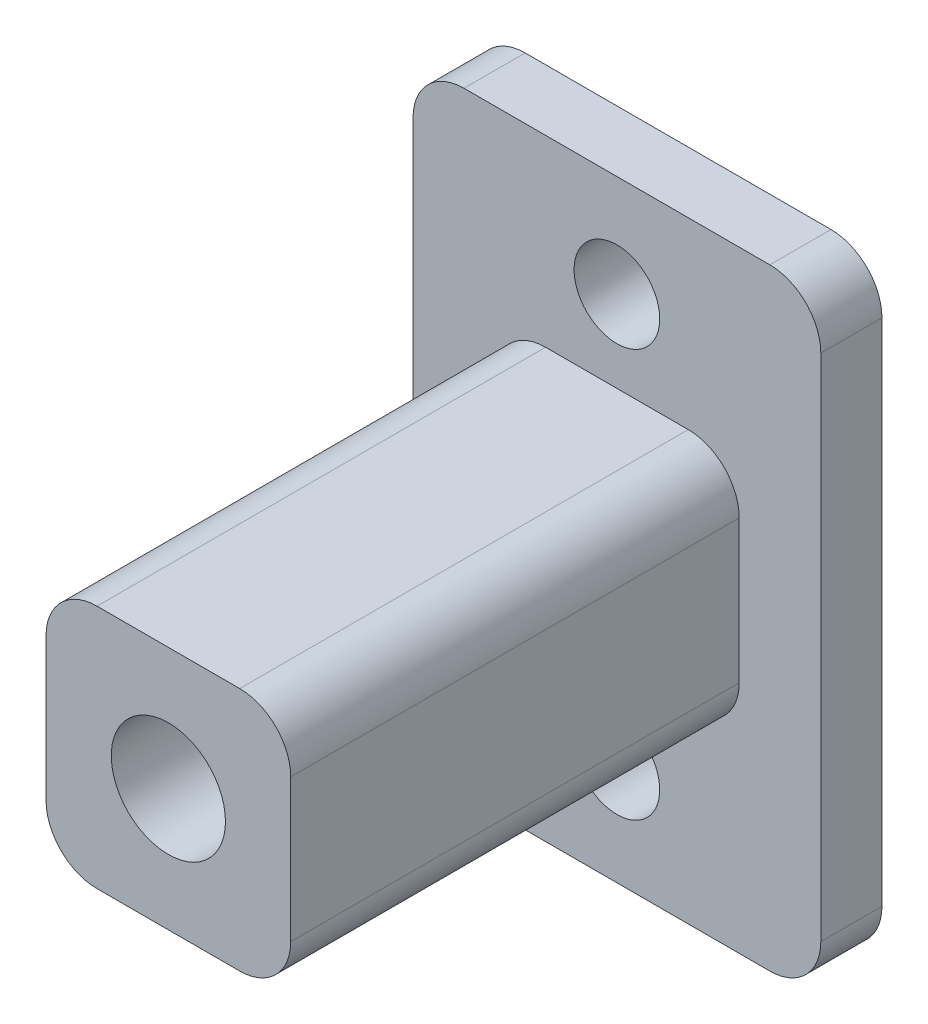
ISO-10303-21;
HEADER;
FILE_DESCRIPTION(('STEP AP214'),'2;1');
FILE_NAME('part.step','',(''),(''),'','','');
FILE_SCHEMA(('AUTOMOTIVE_DESIGN { 1 0 10303 214 1 1 1 1 }'));
ENDSEC;
DATA;
#1=APPLICATION_CONTEXT('core data for automotive mechanical design processes');
#2=APPLICATION_PROTOCOL_DEFINITION('international standard','automotive_design',2000,#1);
#3=PRODUCT_CONTEXT('',#1,'mechanical');
#4=PRODUCT('Part','Part','',(#3));
#5=PRODUCT_RELATED_PRODUCT_CATEGORY('part','',(#4));
#6=PRODUCT_DEFINITION_FORMATION('','',#4);
#7=PRODUCT_DEFINITION_CONTEXT('part definition',#1,'design');
#8=PRODUCT_DEFINITION('design','',#6,#7);
#9=PRODUCT_DEFINITION_SHAPE('','',#8);
#10=(LENGTH_UNIT() NAMED_UNIT(*) SI_UNIT(.MILLI.,.METRE.));
#11=(NAMED_UNIT(*) PLANE_ANGLE_UNIT() SI_UNIT($,.RADIAN.));
#12=(NAMED_UNIT(*) SI_UNIT($,.STERADIAN.) SOLID_ANGLE_UNIT());
#13=UNCERTAINTY_MEASURE_WITH_UNIT(LENGTH_MEASURE(1.E-05),#10,'distance_accuracy_value','');
#14=(GEOMETRIC_REPRESENTATION_CONTEXT(3) GLOBAL_UNCERTAINTY_ASSIGNED_CONTEXT((#13)) GLOBAL_UNIT_ASSIGNED_CONTEXT((#10,
#11,#12)) REPRESENTATION_CONTEXT('',''));
#15=CARTESIAN_POINT('',(0.,0.,0.));
#16=DIRECTION('',(0.,0.,1.));
#17=DIRECTION('',(1.,0.,0.));
#18=AXIS2_PLACEMENT_3D('',#15,#16,#17);
#19=CARTESIAN_POINT('',(0.,0.,3.));
#20=DIRECTION('',(0.,0.,1.));
#21=DIRECTION('',(1.,0.,0.));
#22=AXIS2_PLACEMENT_3D('',#19,#20,#21);
#23=PLANE('',#22);
#24=DIRECTION('',(-1.,0.,0.));
#25=VECTOR('',#24,1.);
#26=CARTESIAN_POINT('',(0.,-6.,3.));
#27=LINE('',#26,#25);
#28=CARTESIAN_POINT('',(3.5,-6.,3.));
#29=VERTEX_POINT('',#28);
#30=CARTESIAN_POINT('',(-3.5,-6.,3.));
#31=VERTEX_POINT('',#30);
#32=EDGE_CURVE('E251',#29,#31,#27,.T.);
#33=ORIENTED_EDGE('',*,*,#32,.T.);
#34=CARTESIAN_POINT('',(-3.5,-3.5,3.));
#35=DIRECTION('',(0.,0.,1.));
#36=DIRECTION('',(1.,0.,0.));
#37=AXIS2_PLACEMENT_3D('',#34,#35,#36);
#38=CIRCLE('',#37,2.5);
#39=CARTESIAN_POINT('',(-6.,-3.5,3.));
#40=VERTEX_POINT('',#39);
#41=EDGE_CURVE('E46',#31,#40,#38,.F.);
#42=ORIENTED_EDGE('',*,*,#41,.T.);
#43=DIRECTION('',(0.,1.,0.));
#44=VECTOR('',#43,1.);
#45=CARTESIAN_POINT('',(-6.,0.,3.));
#46=LINE('',#45,#44);
#47=CARTESIAN_POINT('',(-6.,3.5,3.));
#48=VERTEX_POINT('',#47);
#49=EDGE_CURVE('E250',#40,#48,#46,.T.);
#50=ORIENTED_EDGE('',*,*,#49,.T.);
#51=CARTESIAN_POINT('',(-3.5,3.5,3.));
#52=DIRECTION('',(0.,0.,1.));
#53=DIRECTION('',(1.,0.,0.));
#54=AXIS2_PLACEMENT_3D('',#51,#52,#53);
#55=CIRCLE('',#54,2.5);
#56=CARTESIAN_POINT('',(-3.5,6.,3.));
#57=VERTEX_POINT('',#56);
#58=EDGE_CURVE('E12',#48,#57,#55,.F.);
#59=ORIENTED_EDGE('',*,*,#58,.T.);
#60=DIRECTION('',(-1.,0.,0.));
#61=VECTOR('',#60,1.);
#62=CARTESIAN_POINT('',(0.,6.,3.));
#63=LINE('',#62,#61);
#64=CARTESIAN_POINT('',(3.5,6.,3.));
#65=VERTEX_POINT('',#64);
#66=EDGE_CURVE('E271',#65,#57,#63,.T.);
#67=ORIENTED_EDGE('',*,*,#66,.F.);
#68=CARTESIAN_POINT('',(3.5,3.5,3.));
#69=DIRECTION('',(0.,0.,1.));
#70=DIRECTION('',(1.,0.,0.));
#71=AXIS2_PLACEMENT_3D('',#68,#69,#70);
#72=CIRCLE('',#71,2.5);
#73=CARTESIAN_POINT('',(6.,3.5,3.));
#74=VERTEX_POINT('',#73);
#75=EDGE_CURVE('E242',#65,#74,#72,.F.);
#76=ORIENTED_EDGE('',*,*,#75,.T.);
#77=DIRECTION('',(0.,1.,0.));
#78=VECTOR('',#77,1.);
#79=CARTESIAN_POINT('',(6.,0.,3.));
#80=LINE('',#79,#78);
#81=CARTESIAN_POINT('',(6.,-3.5,3.));
#82=VERTEX_POINT('',#81);
#83=EDGE_CURVE('E279',#82,#74,#80,.T.);
#84=ORIENTED_EDGE('',*,*,#83,.F.);
#85=CARTESIAN_POINT('',(3.5,-3.5,3.));
#86=DIRECTION('',(0.,0.,1.));
#87=DIRECTION('',(1.,0.,0.));
#88=AXIS2_PLACEMENT_3D('',#85,#86,#87);
#89=CIRCLE('',#88,2.5);
#90=EDGE_CURVE('E244',#82,#29,#89,.F.);
#91=ORIENTED_EDGE('',*,*,#90,.T.);
#92=EDGE_LOOP('',(#33,#42,#50,#59,#67,#76,#84,#91));
#93=FACE_BOUND('',#92,.T.);
#94=CARTESIAN_POINT('',(0.,9.99999999999999,3.));
#95=DIRECTION('',(0.,0.,1.));
#96=DIRECTION('',(1.,0.,0.));
#97=AXIS2_PLACEMENT_3D('',#94,#95,#96);
#98=CIRCLE('',#97,2.1);
#99=CARTESIAN_POINT('',(2.1,9.99999999999999,3.));
#100=VERTEX_POINT('',#99);
#101=EDGE_CURVE('E290',#100,#100,#98,.T.);
#102=ORIENTED_EDGE('',*,*,#101,.F.);
#103=EDGE_LOOP('',(#102));
#104=FACE_BOUND('',#103,.T.);
#105=DIRECTION('',(1.,0.,0.));
#106=VECTOR('',#105,1.);
#107=CARTESIAN_POINT('',(10.,-15.,3.));
#108=LINE('',#107,#106);
#109=CARTESIAN_POINT('',(-7.5,-15.,3.));
#110=VERTEX_POINT('',#109);
#111=CARTESIAN_POINT('',(7.5,-15.,3.));
#112=VERTEX_POINT('',#111);
#113=EDGE_CURVE('E297',#110,#112,#108,.T.);
#114=ORIENTED_EDGE('',*,*,#113,.T.);
#115=CARTESIAN_POINT('',(7.5,-12.5,3.));
#116=DIRECTION('',(0.,0.,1.));
#117=DIRECTION('',(1.,0.,0.));
#118=AXIS2_PLACEMENT_3D('',#115,#116,#117);
#119=CIRCLE('',#118,2.5);
#120=CARTESIAN_POINT('',(10.,-12.5,3.));
#121=VERTEX_POINT('',#120);
#122=EDGE_CURVE('E204',#112,#121,#119,.T.);
#123=ORIENTED_EDGE('',*,*,#122,.T.);
#124=DIRECTION('',(0.,1.,0.));
#125=VECTOR('',#124,1.);
#126=CARTESIAN_POINT('',(10.,-15.,3.));
#127=LINE('',#126,#125);
#128=CARTESIAN_POINT('',(10.,12.5,3.));
#129=VERTEX_POINT('',#128);
#130=EDGE_CURVE('E172',#121,#129,#127,.T.);
#131=ORIENTED_EDGE('',*,*,#130,.T.);
#132=CARTESIAN_POINT('',(7.5,12.5,3.));
#133=DIRECTION('',(0.,0.,1.));
#134=DIRECTION('',(1.,0.,0.));
#135=AXIS2_PLACEMENT_3D('',#132,#133,#134);
#136=CIRCLE('',#135,2.5);
#137=CARTESIAN_POINT('',(7.5,15.,3.));
#138=VERTEX_POINT('',#137);
#139=EDGE_CURVE('E202',#129,#138,#136,.T.);
#140=ORIENTED_EDGE('',*,*,#139,.T.);
#141=DIRECTION('',(-1.,0.,0.));
#142=VECTOR('',#141,1.);
#143=CARTESIAN_POINT('',(10.,15.,3.));
#144=LINE('',#143,#142);
#145=CARTESIAN_POINT('',(-7.5,15.,3.));
#146=VERTEX_POINT('',#145);
#147=EDGE_CURVE('E189',#138,#146,#144,.T.);
#148=ORIENTED_EDGE('',*,*,#147,.T.);
#149=CARTESIAN_POINT('',(-7.5,12.5,3.));
#150=DIRECTION('',(0.,0.,1.));
#151=DIRECTION('',(1.,0.,0.));
#152=AXIS2_PLACEMENT_3D('',#149,#150,#151);
#153=CIRCLE('',#152,2.5);
#154=CARTESIAN_POINT('',(-10.,12.5,3.));
#155=VERTEX_POINT('',#154);
#156=EDGE_CURVE('E198',#146,#155,#153,.T.);
#157=ORIENTED_EDGE('',*,*,#156,.T.);
#158=DIRECTION('',(0.,-1.,0.));
#159=VECTOR('',#158,1.);
#160=CARTESIAN_POINT('',(-10.,-15.,3.));
#161=LINE('',#160,#159);
#162=CARTESIAN_POINT('',(-10.,-12.5,3.));
#163=VERTEX_POINT('',#162);
#164=EDGE_CURVE('E183',#155,#163,#161,.T.);
#165=ORIENTED_EDGE('',*,*,#164,.T.);
#166=CARTESIAN_POINT('',(-7.5,-12.5,3.));
#167=DIRECTION('',(0.,0.,1.));
#168=DIRECTION('',(1.,0.,0.));
#169=AXIS2_PLACEMENT_3D('',#166,#167,#168);
#170=CIRCLE('',#169,2.5);
#171=EDGE_CURVE('E200',#163,#110,#170,.T.);
#172=ORIENTED_EDGE('',*,*,#171,.T.);
#173=EDGE_LOOP('',(#114,#123,#131,#140,#148,#157,#165,#172));
#174=FACE_BOUND('',#173,.T.);
#175=CARTESIAN_POINT('',(0.,-9.99999999999999,3.));
#176=DIRECTION('',(0.,0.,1.));
#177=DIRECTION('',(-1.,0.,0.));
#178=AXIS2_PLACEMENT_3D('',#175,#176,#177);
#179=CIRCLE('',#178,2.1);
#180=CARTESIAN_POINT('',(-2.1,-9.99999999999999,3.));
#181=VERTEX_POINT('',#180);
#182=EDGE_CURVE('E284',#181,#181,#179,.T.);
#183=ORIENTED_EDGE('',*,*,#182,.F.);
#184=EDGE_LOOP('',(#183));
#185=FACE_BOUND('',#184,.T.);
#186=ADVANCED_FACE('F38',(#93,#104,#174,#185),#23,.T.);
#187=CARTESIAN_POINT('',(0.,0.,0.));
#188=DIRECTION('',(0.,0.,1.));
#189=DIRECTION('',(1.,0.,0.));
#190=AXIS2_PLACEMENT_3D('',#187,#188,#189);
#191=PLANE('',#190);
#192=DIRECTION('',(0.,1.,0.));
#193=VECTOR('',#192,1.);
#194=CARTESIAN_POINT('',(10.,-15.,0.));
#195=LINE('',#194,#193);
#196=CARTESIAN_POINT('',(10.,-12.5,0.));
#197=VERTEX_POINT('',#196);
#198=CARTESIAN_POINT('',(10.,12.5,0.));
#199=VERTEX_POINT('',#198);
#200=EDGE_CURVE('E169',#197,#199,#195,.T.);
#201=ORIENTED_EDGE('',*,*,#200,.F.);
#202=CARTESIAN_POINT('',(7.5,-12.5,0.));
#203=DIRECTION('',(0.,0.,1.));
#204=DIRECTION('',(1.,0.,0.));
#205=AXIS2_PLACEMENT_3D('',#202,#203,#204);
#206=CIRCLE('',#205,2.5);
#207=CARTESIAN_POINT('',(7.5,-15.,0.));
#208=VERTEX_POINT('',#207);
#209=EDGE_CURVE('E152',#197,#208,#206,.F.);
#210=ORIENTED_EDGE('',*,*,#209,.T.);
#211=DIRECTION('',(1.,0.,0.));
#212=VECTOR('',#211,1.);
#213=CARTESIAN_POINT('',(10.,-15.,0.));
#214=LINE('',#213,#212);
#215=CARTESIAN_POINT('',(-7.5,-15.,0.));
#216=VERTEX_POINT('',#215);
#217=EDGE_CURVE('E180',#216,#208,#214,.T.);
#218=ORIENTED_EDGE('',*,*,#217,.F.);
#219=CARTESIAN_POINT('',(-7.5,-12.5,0.));
#220=DIRECTION('',(0.,0.,1.));
#221=DIRECTION('',(1.,0.,0.));
#222=AXIS2_PLACEMENT_3D('',#219,#220,#221);
#223=CIRCLE('',#222,2.5);
#224=CARTESIAN_POINT('',(-10.,-12.5,0.));
#225=VERTEX_POINT('',#224);
#226=EDGE_CURVE('E192',#216,#225,#223,.F.);
#227=ORIENTED_EDGE('',*,*,#226,.T.);
#228=DIRECTION('',(0.,-1.,0.));
#229=VECTOR('',#228,1.);
#230=CARTESIAN_POINT('',(-10.,-15.,0.));
#231=LINE('',#230,#229);
#232=CARTESIAN_POINT('',(-10.,12.5,0.));
#233=VERTEX_POINT('',#232);
#234=EDGE_CURVE('E185',#233,#225,#231,.T.);
#235=ORIENTED_EDGE('',*,*,#234,.F.);
#236=CARTESIAN_POINT('',(-7.5,12.5,0.));
#237=DIRECTION('',(0.,0.,1.));
#238=DIRECTION('',(1.,0.,0.));
#239=AXIS2_PLACEMENT_3D('',#236,#237,#238);
#240=CIRCLE('',#239,2.5);
#241=CARTESIAN_POINT('',(-7.5,15.,0.));
#242=VERTEX_POINT('',#241);
#243=EDGE_CURVE('E173',#233,#242,#240,.F.);
#244=ORIENTED_EDGE('',*,*,#243,.T.);
#245=DIRECTION('',(-1.,0.,0.));
#246=VECTOR('',#245,1.);
#247=CARTESIAN_POINT('',(10.,15.,0.));
#248=LINE('',#247,#246);
#249=CARTESIAN_POINT('',(7.5,15.,0.));
#250=VERTEX_POINT('',#249);
#251=EDGE_CURVE('E179',#250,#242,#248,.T.);
#252=ORIENTED_EDGE('',*,*,#251,.F.);
#253=CARTESIAN_POINT('',(7.5,12.5,0.));
#254=DIRECTION('',(0.,0.,1.));
#255=DIRECTION('',(1.,0.,0.));
#256=AXIS2_PLACEMENT_3D('',#253,#254,#255);
#257=CIRCLE('',#256,2.5);
#258=EDGE_CURVE('E163',#250,#199,#257,.F.);
#259=ORIENTED_EDGE('',*,*,#258,.T.);
#260=EDGE_LOOP('',(#201,#210,#218,#227,#235,#244,#252,#259));
#261=FACE_BOUND('',#260,.T.);
#262=CARTESIAN_POINT('',(0.,9.99999999999999,0.));
#263=DIRECTION('',(0.,0.,1.));
#264=DIRECTION('',(1.,0.,0.));
#265=AXIS2_PLACEMENT_3D('',#262,#263,#264);
#266=CIRCLE('',#265,2.1);
#267=CARTESIAN_POINT('',(2.1,9.99999999999999,0.));
#268=VERTEX_POINT('',#267);
#269=EDGE_CURVE('E287',#268,#268,#266,.T.);
#270=ORIENTED_EDGE('',*,*,#269,.T.);
#271=EDGE_LOOP('',(#270));
#272=FACE_BOUND('',#271,.T.);
#273=CARTESIAN_POINT('',(0.,-9.99999999999999,0.));
#274=DIRECTION('',(0.,0.,1.));
#275=DIRECTION('',(-1.,0.,0.));
#276=AXIS2_PLACEMENT_3D('',#273,#274,#275);
#277=CIRCLE('',#276,2.1);
#278=CARTESIAN_POINT('',(-2.1,-9.99999999999999,0.));
#279=VERTEX_POINT('',#278);
#280=EDGE_CURVE('E276',#279,#279,#277,.T.);
#281=ORIENTED_EDGE('',*,*,#280,.T.);
#282=EDGE_LOOP('',(#281));
#283=FACE_BOUND('',#282,.T.);
#284=ADVANCED_FACE('F176',(#261,#272,#283),#191,.F.);
#285=CARTESIAN_POINT('',(-10.,-15.,3.));
#286=DIRECTION('',(1.,0.,0.));
#287=DIRECTION('',(0.,0.,-1.));
#288=AXIS2_PLACEMENT_3D('',#285,#286,#287);
#289=PLANE('',#288);
#290=ORIENTED_EDGE('',*,*,#234,.T.);
#291=DIRECTION('',(0.,0.,-1.));
#292=VECTOR('',#291,1.);
#293=CARTESIAN_POINT('',(-10.,-12.5,3.));
#294=LINE('',#293,#292);
#295=EDGE_CURVE('E235',#225,#163,#294,.F.);
#296=ORIENTED_EDGE('',*,*,#295,.T.);
#297=ORIENTED_EDGE('',*,*,#164,.F.);
#298=DIRECTION('',(0.,0.,-1.));
#299=VECTOR('',#298,1.);
#300=CARTESIAN_POINT('',(-10.,12.5,3.));
#301=LINE('',#300,#299);
#302=EDGE_CURVE('E232',#155,#233,#301,.T.);
#303=ORIENTED_EDGE('',*,*,#302,.T.);
#304=EDGE_LOOP('',(#290,#296,#297,#303));
#305=FACE_BOUND('',#304,.T.);
#306=ADVANCED_FACE('F306',(#305),#289,.F.);
#307=CARTESIAN_POINT('',(10.,-15.,3.));
#308=DIRECTION('',(0.,1.,0.));
#309=DIRECTION('',(-1.,0.,0.));
#310=AXIS2_PLACEMENT_3D('',#307,#308,#309);
#311=PLANE('',#310);
#312=ORIENTED_EDGE('',*,*,#217,.T.);
#313=DIRECTION('',(0.,0.,-1.));
#314=VECTOR('',#313,1.);
#315=CARTESIAN_POINT('',(7.5,-15.,3.));
#316=LINE('',#315,#314);
#317=EDGE_CURVE('E157',#208,#112,#316,.F.);
#318=ORIENTED_EDGE('',*,*,#317,.T.);
#319=ORIENTED_EDGE('',*,*,#113,.F.);
#320=DIRECTION('',(0.,0.,-1.));
#321=VECTOR('',#320,1.);
#322=CARTESIAN_POINT('',(-7.5,-15.,3.));
#323=LINE('',#322,#321);
#324=EDGE_CURVE('E162',#110,#216,#323,.T.);
#325=ORIENTED_EDGE('',*,*,#324,.T.);
#326=EDGE_LOOP('',(#312,#318,#319,#325));
#327=FACE_BOUND('',#326,.T.);
#328=ADVANCED_FACE('F317',(#327),#311,.F.);
#329=CARTESIAN_POINT('',(10.,-15.,3.));
#330=DIRECTION('',(-1.,0.,0.));
#331=DIRECTION('',(0.,0.,1.));
#332=AXIS2_PLACEMENT_3D('',#329,#330,#331);
#333=PLANE('',#332);
#334=ORIENTED_EDGE('',*,*,#130,.F.);
#335=DIRECTION('',(0.,0.,-1.));
#336=VECTOR('',#335,1.);
#337=CARTESIAN_POINT('',(10.,-12.5,3.));
#338=LINE('',#337,#336);
#339=EDGE_CURVE('E156',#121,#197,#338,.T.);
#340=ORIENTED_EDGE('',*,*,#339,.T.);
#341=ORIENTED_EDGE('',*,*,#200,.T.);
#342=DIRECTION('',(0.,0.,-1.));
#343=VECTOR('',#342,1.);
#344=CARTESIAN_POINT('',(10.,12.5,3.));
#345=LINE('',#344,#343);
#346=EDGE_CURVE('E174',#199,#129,#345,.F.);
#347=ORIENTED_EDGE('',*,*,#346,.T.);
#348=EDGE_LOOP('',(#334,#340,#341,#347));
#349=FACE_BOUND('',#348,.T.);
#350=ADVANCED_FACE('F168',(#349),#333,.F.);
#351=CARTESIAN_POINT('',(10.,15.,3.));
#352=DIRECTION('',(0.,-1.,0.));
#353=DIRECTION('',(1.,0.,0.));
#354=AXIS2_PLACEMENT_3D('',#351,#352,#353);
#355=PLANE('',#354);
#356=ORIENTED_EDGE('',*,*,#147,.F.);
#357=DIRECTION('',(0.,0.,-1.));
#358=VECTOR('',#357,1.);
#359=CARTESIAN_POINT('',(7.5,15.,3.));
#360=LINE('',#359,#358);
#361=EDGE_CURVE('E225',#138,#250,#360,.T.);
#362=ORIENTED_EDGE('',*,*,#361,.T.);
#363=ORIENTED_EDGE('',*,*,#251,.T.);
#364=DIRECTION('',(0.,0.,-1.));
#365=VECTOR('',#364,1.);
#366=CARTESIAN_POINT('',(-7.5,15.,3.));
#367=LINE('',#366,#365);
#368=EDGE_CURVE('E223',#242,#146,#367,.F.);
#369=ORIENTED_EDGE('',*,*,#368,.T.);
#370=EDGE_LOOP('',(#356,#362,#363,#369));
#371=FACE_BOUND('',#370,.T.);
#372=ADVANCED_FACE('F324',(#371),#355,.F.);
#373=CARTESIAN_POINT('',(0.,9.99999999999999,3.));
#374=DIRECTION('',(0.,0.,-1.));
#375=DIRECTION('',(-1.,0.,0.));
#376=AXIS2_PLACEMENT_3D('',#373,#374,#375);
#377=CYLINDRICAL_SURFACE('',#376,2.1);
#378=ORIENTED_EDGE('',*,*,#101,.T.);
#379=EDGE_LOOP('',(#378));
#380=FACE_BOUND('',#379,.T.);
#381=ORIENTED_EDGE('',*,*,#269,.F.);
#382=EDGE_LOOP('',(#381));
#383=FACE_BOUND('',#382,.T.);
#384=ADVANCED_FACE('F334',(#380,#383),#377,.F.);
#385=CARTESIAN_POINT('',(0.,-9.99999999999999,3.));
#386=DIRECTION('',(0.,0.,-1.));
#387=DIRECTION('',(-1.,0.,0.));
#388=AXIS2_PLACEMENT_3D('',#385,#386,#387);
#389=CYLINDRICAL_SURFACE('',#388,2.1);
#390=ORIENTED_EDGE('',*,*,#182,.T.);
#391=EDGE_LOOP('',(#390));
#392=FACE_BOUND('',#391,.T.);
#393=ORIENTED_EDGE('',*,*,#280,.F.);
#394=EDGE_LOOP('',(#393));
#395=FACE_BOUND('',#394,.T.);
#396=ADVANCED_FACE('F342',(#392,#395),#389,.F.);
#397=CARTESIAN_POINT('',(-6.,0.,25.));
#398=DIRECTION('',(-1.,0.,0.));
#399=DIRECTION('',(0.,0.,1.));
#400=AXIS2_PLACEMENT_3D('',#397,#398,#399);
#401=PLANE('',#400);
#402=ORIENTED_EDGE('',*,*,#49,.F.);
#403=DIRECTION('',(0.,0.,-1.));
#404=VECTOR('',#403,1.);
#405=CARTESIAN_POINT('',(-6.,-3.5,25.));
#406=LINE('',#405,#404);
#407=CARTESIAN_POINT('',(-6.,-3.5,25.));
#408=VERTEX_POINT('',#407);
#409=EDGE_CURVE('E240',#40,#408,#406,.F.);
#410=ORIENTED_EDGE('',*,*,#409,.T.);
#411=DIRECTION('',(0.,1.,0.));
#412=VECTOR('',#411,1.);
#413=CARTESIAN_POINT('',(-6.,0.,25.));
#414=LINE('',#413,#412);
#415=CARTESIAN_POINT('',(-6.,3.5,25.));
#416=VERTEX_POINT('',#415);
#417=EDGE_CURVE('E266',#408,#416,#414,.T.);
#418=ORIENTED_EDGE('',*,*,#417,.T.);
#419=DIRECTION('',(0.,0.,-1.));
#420=VECTOR('',#419,1.);
#421=CARTESIAN_POINT('',(-6.,3.5,3.));
#422=LINE('',#421,#420);
#423=EDGE_CURVE('E237',#416,#48,#422,.T.);
#424=ORIENTED_EDGE('',*,*,#423,.T.);
#425=EDGE_LOOP('',(#402,#410,#418,#424));
#426=FACE_BOUND('',#425,.T.);
#427=ADVANCED_FACE('F256',(#426),#401,.T.);
#428=CARTESIAN_POINT('',(0.,-6.,25.));
#429=DIRECTION('',(0.,-1.,0.));
#430=DIRECTION('',(1.,0.,0.));
#431=AXIS2_PLACEMENT_3D('',#428,#429,#430);
#432=PLANE('',#431);
#433=ORIENTED_EDGE('',*,*,#32,.F.);
#434=DIRECTION('',(0.,0.,-1.));
#435=VECTOR('',#434,1.);
#436=CARTESIAN_POINT('',(3.5,-6.,25.));
#437=LINE('',#436,#435);
#438=CARTESIAN_POINT('',(3.5,-6.,25.));
#439=VERTEX_POINT('',#438);
#440=EDGE_CURVE('E60',#29,#439,#437,.F.);
#441=ORIENTED_EDGE('',*,*,#440,.T.);
#442=DIRECTION('',(-1.,0.,0.));
#443=VECTOR('',#442,1.);
#444=CARTESIAN_POINT('',(0.,-6.,25.));
#445=LINE('',#444,#443);
#446=CARTESIAN_POINT('',(-3.5,-6.,25.));
#447=VERTEX_POINT('',#446);
#448=EDGE_CURVE('E263',#439,#447,#445,.T.);
#449=ORIENTED_EDGE('',*,*,#448,.T.);
#450=DIRECTION('',(0.,0.,-1.));
#451=VECTOR('',#450,1.);
#452=CARTESIAN_POINT('',(-3.5,-6.,25.));
#453=LINE('',#452,#451);
#454=EDGE_CURVE('E228',#447,#31,#453,.T.);
#455=ORIENTED_EDGE('',*,*,#454,.T.);
#456=EDGE_LOOP('',(#433,#441,#449,#455));
#457=FACE_BOUND('',#456,.T.);
#458=ADVANCED_FACE('F262',(#457),#432,.T.);
#459=CARTESIAN_POINT('',(6.,0.,25.));
#460=DIRECTION('',(-1.,0.,0.));
#461=DIRECTION('',(0.,0.,1.));
#462=AXIS2_PLACEMENT_3D('',#459,#460,#461);
#463=PLANE('',#462);
#464=ORIENTED_EDGE('',*,*,#83,.T.);
#465=DIRECTION('',(0.,0.,-1.));
#466=VECTOR('',#465,1.);
#467=CARTESIAN_POINT('',(6.,3.5,25.));
#468=LINE('',#467,#466);
#469=CARTESIAN_POINT('',(6.,3.5,25.));
#470=VERTEX_POINT('',#469);
#471=EDGE_CURVE('E214',#74,#470,#468,.F.);
#472=ORIENTED_EDGE('',*,*,#471,.T.);
#473=DIRECTION('',(0.,1.,0.));
#474=VECTOR('',#473,1.);
#475=CARTESIAN_POINT('',(6.,0.,25.));
#476=LINE('',#475,#474);
#477=CARTESIAN_POINT('',(6.,-3.5,25.));
#478=VERTEX_POINT('',#477);
#479=EDGE_CURVE('E265',#478,#470,#476,.T.);
#480=ORIENTED_EDGE('',*,*,#479,.F.);
#481=DIRECTION('',(0.,0.,-1.));
#482=VECTOR('',#481,1.);
#483=CARTESIAN_POINT('',(6.,-3.5,3.));
#484=LINE('',#483,#482);
#485=EDGE_CURVE('E211',#478,#82,#484,.T.);
#486=ORIENTED_EDGE('',*,*,#485,.T.);
#487=EDGE_LOOP('',(#464,#472,#480,#486));
#488=FACE_BOUND('',#487,.T.);
#489=ADVANCED_FACE('F387',(#488),#463,.F.);
#490=CARTESIAN_POINT('',(0.,6.,25.));
#491=DIRECTION('',(0.,-1.,0.));
#492=DIRECTION('',(1.,0.,0.));
#493=AXIS2_PLACEMENT_3D('',#490,#491,#492);
#494=PLANE('',#493);
#495=DIRECTION('',(-1.,0.,0.));
#496=VECTOR('',#495,1.);
#497=CARTESIAN_POINT('',(0.,6.,25.));
#498=LINE('',#497,#496);
#499=CARTESIAN_POINT('',(3.5,6.,25.));
#500=VERTEX_POINT('',#499);
#501=CARTESIAN_POINT('',(-3.5,6.,25.));
#502=VERTEX_POINT('',#501);
#503=EDGE_CURVE('E269',#500,#502,#498,.T.);
#504=ORIENTED_EDGE('',*,*,#503,.F.);
#505=DIRECTION('',(0.,0.,-1.));
#506=VECTOR('',#505,1.);
#507=CARTESIAN_POINT('',(3.5,6.,25.));
#508=LINE('',#507,#506);
#509=EDGE_CURVE('E208',#500,#65,#508,.T.);
#510=ORIENTED_EDGE('',*,*,#509,.T.);
#511=ORIENTED_EDGE('',*,*,#66,.T.);
#512=DIRECTION('',(0.,0.,-1.));
#513=VECTOR('',#512,1.);
#514=CARTESIAN_POINT('',(-3.5,6.,25.));
#515=LINE('',#514,#513);
#516=EDGE_CURVE('E206',#57,#502,#515,.F.);
#517=ORIENTED_EDGE('',*,*,#516,.T.);
#518=EDGE_LOOP('',(#504,#510,#511,#517));
#519=FACE_BOUND('',#518,.T.);
#520=ADVANCED_FACE('F382',(#519),#494,.F.);
#521=CARTESIAN_POINT('',(0.,0.,25.));
#522=DIRECTION('',(0.,0.,1.));
#523=DIRECTION('',(1.,0.,0.));
#524=AXIS2_PLACEMENT_3D('',#521,#522,#523);
#525=PLANE('',#524);
#526=CARTESIAN_POINT('',(0.,0.,25.));
#527=DIRECTION('',(0.,0.,1.));
#528=DIRECTION('',(1.,0.,0.));
#529=AXIS2_PLACEMENT_3D('',#526,#527,#528);
#530=CIRCLE('',#529,2.8);
#531=CARTESIAN_POINT('',(2.8,0.,25.));
#532=VERTEX_POINT('',#531);
#533=EDGE_CURVE('E511',#532,#532,#530,.T.);
#534=ORIENTED_EDGE('',*,*,#533,.F.);
#535=EDGE_LOOP('',(#534));
#536=FACE_BOUND('',#535,.T.);
#537=ORIENTED_EDGE('',*,*,#479,.T.);
#538=CARTESIAN_POINT('',(3.5,3.5,25.));
#539=DIRECTION('',(0.,0.,1.));
#540=DIRECTION('',(1.,0.,0.));
#541=AXIS2_PLACEMENT_3D('',#538,#539,#540);
#542=CIRCLE('',#541,2.5);
#543=EDGE_CURVE('E221',#470,#500,#542,.T.);
#544=ORIENTED_EDGE('',*,*,#543,.T.);
#545=ORIENTED_EDGE('',*,*,#503,.T.);
#546=CARTESIAN_POINT('',(-3.5,3.5,25.));
#547=DIRECTION('',(0.,0.,1.));
#548=DIRECTION('',(1.,0.,0.));
#549=AXIS2_PLACEMENT_3D('',#546,#547,#548);
#550=CIRCLE('',#549,2.5);
#551=EDGE_CURVE('E216',#502,#416,#550,.T.);
#552=ORIENTED_EDGE('',*,*,#551,.T.);
#553=ORIENTED_EDGE('',*,*,#417,.F.);
#554=CARTESIAN_POINT('',(-3.5,-3.5,25.));
#555=DIRECTION('',(0.,0.,1.));
#556=DIRECTION('',(1.,0.,0.));
#557=AXIS2_PLACEMENT_3D('',#554,#555,#556);
#558=CIRCLE('',#557,2.5);
#559=EDGE_CURVE('E53',#408,#447,#558,.T.);
#560=ORIENTED_EDGE('',*,*,#559,.T.);
#561=ORIENTED_EDGE('',*,*,#448,.F.);
#562=CARTESIAN_POINT('',(3.5,-3.5,25.));
#563=DIRECTION('',(0.,0.,1.));
#564=DIRECTION('',(1.,0.,0.));
#565=AXIS2_PLACEMENT_3D('',#562,#563,#564);
#566=CIRCLE('',#565,2.5);
#567=EDGE_CURVE('E219',#439,#478,#566,.T.);
#568=ORIENTED_EDGE('',*,*,#567,.T.);
#569=EDGE_LOOP('',(#537,#544,#545,#552,#553,#560,#561,#568));
#570=FACE_BOUND('',#569,.T.);
#571=ADVANCED_FACE('F377',(#536,#570),#525,.T.);
#572=CARTESIAN_POINT('',(0.,0.,15.9));
#573=DIRECTION('',(0.,0.,1.));
#574=DIRECTION('',(1.,0.,0.));
#575=AXIS2_PLACEMENT_3D('',#572,#573,#574);
#576=CYLINDRICAL_SURFACE('',#575,2.8);
#577=CARTESIAN_POINT('',(0.,0.,15.9));
#578=DIRECTION('',(0.,0.,1.));
#579=DIRECTION('',(1.,0.,0.));
#580=AXIS2_PLACEMENT_3D('',#577,#578,#579);
#581=CIRCLE('',#580,2.8);
#582=CARTESIAN_POINT('',(2.8,0.,15.9));
#583=VERTEX_POINT('',#582);
#584=EDGE_CURVE('E259',#583,#583,#581,.T.);
#585=ORIENTED_EDGE('',*,*,#584,.F.);
#586=EDGE_LOOP('',(#585));
#587=FACE_BOUND('',#586,.T.);
#588=ORIENTED_EDGE('',*,*,#533,.T.);
#589=EDGE_LOOP('',(#588));
#590=FACE_BOUND('',#589,.T.);
#591=ADVANCED_FACE('F439',(#587,#590),#576,.F.);
#592=CARTESIAN_POINT('',(0.,0.,15.9));
#593=DIRECTION('',(0.,0.,1.));
#594=DIRECTION('',(1.,0.,0.));
#595=AXIS2_PLACEMENT_3D('',#592,#593,#594);
#596=PLANE('',#595);
#597=ORIENTED_EDGE('',*,*,#584,.T.);
#598=EDGE_LOOP('',(#597));
#599=FACE_BOUND('',#598,.T.);
#600=ADVANCED_FACE('F450',(#599),#596,.T.);
#601=CARTESIAN_POINT('',(7.5,-12.5,3.));
#602=DIRECTION('',(0.,0.,-1.));
#603=DIRECTION('',(-1.,0.,0.));
#604=AXIS2_PLACEMENT_3D('',#601,#602,#603);
#605=CYLINDRICAL_SURFACE('',#604,2.5);
#606=ORIENTED_EDGE('',*,*,#122,.F.);
#607=ORIENTED_EDGE('',*,*,#317,.F.);
#608=ORIENTED_EDGE('',*,*,#209,.F.);
#609=ORIENTED_EDGE('',*,*,#339,.F.);
#610=EDGE_LOOP('',(#606,#607,#608,#609));
#611=FACE_BOUND('',#610,.T.);
#612=ADVANCED_FACE('F155',(#611),#605,.T.);
#613=CARTESIAN_POINT('',(3.5,3.5,25.));
#614=DIRECTION('',(0.,0.,-1.));
#615=DIRECTION('',(-1.,0.,0.));
#616=AXIS2_PLACEMENT_3D('',#613,#614,#615);
#617=CYLINDRICAL_SURFACE('',#616,2.5);
#618=ORIENTED_EDGE('',*,*,#543,.F.);
#619=ORIENTED_EDGE('',*,*,#471,.F.);
#620=ORIENTED_EDGE('',*,*,#75,.F.);
#621=ORIENTED_EDGE('',*,*,#509,.F.);
#622=EDGE_LOOP('',(#618,#619,#620,#621));
#623=FACE_BOUND('',#622,.T.);
#624=ADVANCED_FACE('F353',(#623),#617,.T.);
#625=CARTESIAN_POINT('',(7.5,12.5,3.));
#626=DIRECTION('',(0.,0.,-1.));
#627=DIRECTION('',(-1.,0.,0.));
#628=AXIS2_PLACEMENT_3D('',#625,#626,#627);
#629=CYLINDRICAL_SURFACE('',#628,2.5);
#630=ORIENTED_EDGE('',*,*,#139,.F.);
#631=ORIENTED_EDGE('',*,*,#346,.F.);
#632=ORIENTED_EDGE('',*,*,#258,.F.);
#633=ORIENTED_EDGE('',*,*,#361,.F.);
#634=EDGE_LOOP('',(#630,#631,#632,#633));
#635=FACE_BOUND('',#634,.T.);
#636=ADVANCED_FACE('F350',(#635),#629,.T.);
#637=CARTESIAN_POINT('',(3.5,-3.5,25.));
#638=DIRECTION('',(0.,0.,1.));
#639=DIRECTION('',(1.,0.,0.));
#640=AXIS2_PLACEMENT_3D('',#637,#638,#639);
#641=CYLINDRICAL_SURFACE('',#640,2.5);
#642=ORIENTED_EDGE('',*,*,#567,.F.);
#643=ORIENTED_EDGE('',*,*,#440,.F.);
#644=ORIENTED_EDGE('',*,*,#90,.F.);
#645=ORIENTED_EDGE('',*,*,#485,.F.);
#646=EDGE_LOOP('',(#642,#643,#644,#645));
#647=FACE_BOUND('',#646,.T.);
#648=ADVANCED_FACE('F352',(#647),#641,.T.);
#649=CARTESIAN_POINT('',(-7.5,-12.5,3.));
#650=DIRECTION('',(0.,0.,-1.));
#651=DIRECTION('',(-1.,0.,0.));
#652=AXIS2_PLACEMENT_3D('',#649,#650,#651);
#653=CYLINDRICAL_SURFACE('',#652,2.5);
#654=ORIENTED_EDGE('',*,*,#171,.F.);
#655=ORIENTED_EDGE('',*,*,#295,.F.);
#656=ORIENTED_EDGE('',*,*,#226,.F.);
#657=ORIENTED_EDGE('',*,*,#324,.F.);
#658=EDGE_LOOP('',(#654,#655,#656,#657));
#659=FACE_BOUND('',#658,.T.);
#660=ADVANCED_FACE('F311',(#659),#653,.T.);
#661=CARTESIAN_POINT('',(-3.5,-3.5,25.));
#662=DIRECTION('',(0.,0.,-1.));
#663=DIRECTION('',(-1.,0.,0.));
#664=AXIS2_PLACEMENT_3D('',#661,#662,#663);
#665=CYLINDRICAL_SURFACE('',#664,2.5);
#666=ORIENTED_EDGE('',*,*,#559,.F.);
#667=ORIENTED_EDGE('',*,*,#409,.F.);
#668=ORIENTED_EDGE('',*,*,#41,.F.);
#669=ORIENTED_EDGE('',*,*,#454,.F.);
#670=EDGE_LOOP('',(#666,#667,#668,#669));
#671=FACE_BOUND('',#670,.T.);
#672=ADVANCED_FACE('F261',(#671),#665,.T.);
#673=CARTESIAN_POINT('',(-3.5,3.5,25.));
#674=DIRECTION('',(0.,0.,1.));
#675=DIRECTION('',(1.,0.,0.));
#676=AXIS2_PLACEMENT_3D('',#673,#674,#675);
#677=CYLINDRICAL_SURFACE('',#676,2.5);
#678=ORIENTED_EDGE('',*,*,#551,.F.);
#679=ORIENTED_EDGE('',*,*,#516,.F.);
#680=ORIENTED_EDGE('',*,*,#58,.F.);
#681=ORIENTED_EDGE('',*,*,#423,.F.);
#682=EDGE_LOOP('',(#678,#679,#680,#681));
#683=FACE_BOUND('',#682,.T.);
#684=ADVANCED_FACE('F368',(#683),#677,.T.);
#685=CARTESIAN_POINT('',(-7.5,12.5,3.));
#686=DIRECTION('',(0.,0.,-1.));
#687=DIRECTION('',(-1.,0.,0.));
#688=AXIS2_PLACEMENT_3D('',#685,#686,#687);
#689=CYLINDRICAL_SURFACE('',#688,2.5);
#690=ORIENTED_EDGE('',*,*,#156,.F.);
#691=ORIENTED_EDGE('',*,*,#368,.F.);
#692=ORIENTED_EDGE('',*,*,#243,.F.);
#693=ORIENTED_EDGE('',*,*,#302,.F.);
#694=EDGE_LOOP('',(#690,#691,#692,#693));
#695=FACE_BOUND('',#694,.T.);
#696=ADVANCED_FACE('F40',(#695),#689,.T.);
#697=CLOSED_SHELL('',(#186,#284,#306,#328,#350,#372,#384,#396,#427,#458,#489,#520,#571,#591,
#600,#612,#624,#636,#648,#660,#672,#684,#696));
#698=MANIFOLD_SOLID_BREP('B2',#697);
#699=ADVANCED_BREP_SHAPE_REPRESENTATION('',(#18,#698),#14);
#700=SHAPE_DEFINITION_REPRESENTATION(#9,#699);
ENDSEC;
END-ISO-10303-21;
